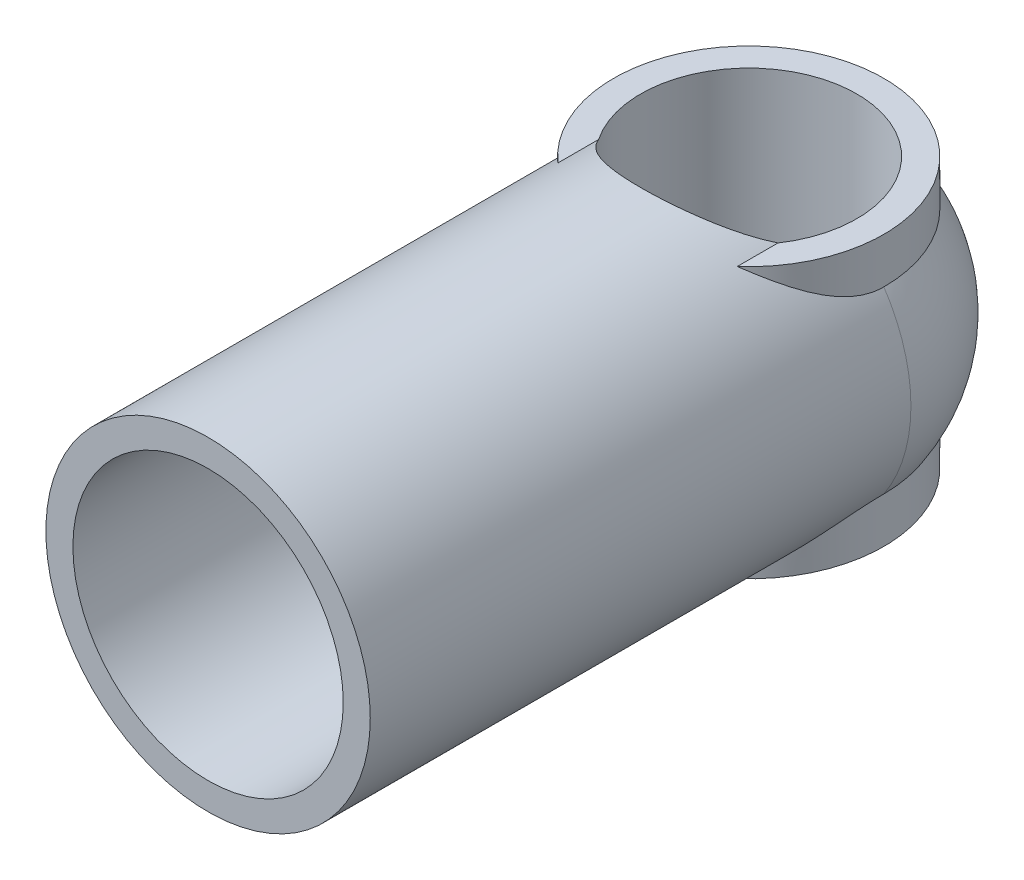
ISO-10303-21;
HEADER;
FILE_DESCRIPTION(('STEP AP214'),'2;1');
FILE_NAME('part.step','',(''),(''),'','','');
FILE_SCHEMA(('AUTOMOTIVE_DESIGN { 1 0 10303 214 1 1 1 1 }'));
ENDSEC;
DATA;
#1=APPLICATION_CONTEXT('core data for automotive mechanical design processes');
#2=APPLICATION_PROTOCOL_DEFINITION('international standard','automotive_design',2000,#1);
#3=PRODUCT_CONTEXT('',#1,'mechanical');
#4=PRODUCT('Part','Part','',(#3));
#5=PRODUCT_RELATED_PRODUCT_CATEGORY('part','',(#4));
#6=PRODUCT_DEFINITION_FORMATION('','',#4);
#7=PRODUCT_DEFINITION_CONTEXT('part definition',#1,'design');
#8=PRODUCT_DEFINITION('design','',#6,#7);
#9=PRODUCT_DEFINITION_SHAPE('','',#8);
#10=(LENGTH_UNIT() NAMED_UNIT(*) SI_UNIT(.MILLI.,.METRE.));
#11=(NAMED_UNIT(*) PLANE_ANGLE_UNIT() SI_UNIT($,.RADIAN.));
#12=(NAMED_UNIT(*) SI_UNIT($,.STERADIAN.) SOLID_ANGLE_UNIT());
#13=UNCERTAINTY_MEASURE_WITH_UNIT(LENGTH_MEASURE(1.E-05),#10,'distance_accuracy_value','');
#14=(GEOMETRIC_REPRESENTATION_CONTEXT(3) GLOBAL_UNCERTAINTY_ASSIGNED_CONTEXT((#13)) GLOBAL_UNIT_ASSIGNED_CONTEXT((#10,
#11,#12)) REPRESENTATION_CONTEXT('',''));
#15=CARTESIAN_POINT('',(0.,0.,0.));
#16=DIRECTION('',(0.,0.,1.));
#17=DIRECTION('',(1.,0.,0.));
#18=AXIS2_PLACEMENT_3D('',#15,#16,#17);
#19=CARTESIAN_POINT('',(0.,0.,40.));
#20=DIRECTION('',(0.,0.,-1.));
#21=DIRECTION('',(-1.,0.,0.));
#22=AXIS2_PLACEMENT_3D('',#19,#20,#21);
#23=CYLINDRICAL_SURFACE('',#22,12.);
#24=CARTESIAN_POINT('',(0.,0.,40.));
#25=DIRECTION('',(0.,0.,1.));
#26=DIRECTION('',(1.,0.,0.));
#27=AXIS2_PLACEMENT_3D('',#24,#25,#26);
#28=CIRCLE('',#27,12.);
#29=CARTESIAN_POINT('',(12.,0.,40.));
#30=VERTEX_POINT('',#29);
#31=EDGE_CURVE('E172',#30,#30,#28,.T.);
#32=ORIENTED_EDGE('',*,*,#31,.F.);
#33=EDGE_LOOP('',(#32));
#34=FACE_BOUND('',#33,.T.);
#35=DIRECTION('',(0.,0.,-1.));
#36=VECTOR('',#35,1.);
#37=CARTESIAN_POINT('',(-6.63324958071081,-10.,40.));
#38=LINE('',#37,#36);
#39=CARTESIAN_POINT('',(-6.63324958071081,-10.,4.47213595499957));
#40=VERTEX_POINT('',#39);
#41=CARTESIAN_POINT('',(-6.63324958071081,-10.,7.48331477354788));
#42=VERTEX_POINT('',#41);
#43=EDGE_CURVE('E94',#40,#42,#38,.F.);
#44=ORIENTED_EDGE('',*,*,#43,.F.);
#45=CARTESIAN_POINT('',(-8.,-8.94427190999916,-1.04083408558608E-13));
#46=CARTESIAN_POINT('',(-8.00000156789018,-8.94426730556881,0.0983267580334694));
#47=CARTESIAN_POINT('',(-7.99818670435959,-8.94589413251496,0.19663692154409));
#48=CARTESIAN_POINT('',(-7.99094455096907,-8.95236504839336,0.393008480709832));
#49=CARTESIAN_POINT('',(-7.98551762121139,-8.95720881661493,0.491069900185157));
#50=CARTESIAN_POINT('',(-7.96387184062538,-8.97647716057883,0.784275547939782));
#51=CARTESIAN_POINT('',(-7.94228785626225,-8.99563906641541,0.97875561296264));
#52=CARTESIAN_POINT('',(-7.88553713067692,-9.04542400400453,1.3621756628165));
#53=CARTESIAN_POINT('',(-7.85050660718139,-9.07593200272896,1.5511513890597));
#54=CARTESIAN_POINT('',(-7.76746828307472,-9.14709903834019,1.92431409503248));
#55=CARTESIAN_POINT('',(-7.71945670791759,-9.18776102747531,2.10849966480892));
#56=CARTESIAN_POINT('',(-7.61144235043443,-9.27743689505695,2.47009563813124));
#57=CARTESIAN_POINT('',(-7.55150366675385,-9.32640593075368,2.64753646548088));
#58=CARTESIAN_POINT('',(-7.42016704049034,-9.43123454567664,2.99596211553798));
#59=CARTESIAN_POINT('',(-7.34876968036537,-9.48709377463288,3.16694726584969));
#60=CARTESIAN_POINT('',(-7.11790219790263,-9.66296505643642,3.67043005761594));
#61=CARTESIAN_POINT('',(-6.94199342859117,-9.79106502579735,3.9926754805717));
#62=CARTESIAN_POINT('',(-6.51998353653231,-10.0779176796739,4.65477324863641));
#63=CARTESIAN_POINT('',(-6.26723770899271,-10.238349008843,4.98965909743894));
#64=CARTESIAN_POINT('',(-5.85130862662402,-10.4779751838524,5.45948237205756));
#65=CARTESIAN_POINT('',(-5.70644773413527,-10.5577206171585,5.61074098939437));
#66=CARTESIAN_POINT('',(-5.40469571644934,-10.7153255023664,5.90196899658744));
#67=CARTESIAN_POINT('',(-5.24780180328283,-10.7931845116643,6.04193575468898));
#68=CARTESIAN_POINT('',(-4.89878029332723,-10.9564719143012,6.32931356915454));
#69=CARTESIAN_POINT('',(-4.7048463828437,-11.041355236874,6.47484878457443));
#70=CARTESIAN_POINT('',(-4.30264095559407,-11.2042099811284,6.74881076463315));
#71=CARTESIAN_POINT('',(-4.09437619772499,-11.2821846220097,6.87724551165713));
#72=CARTESIAN_POINT('',(-3.66459638595399,-11.4290096326993,7.11555065215359));
#73=CARTESIAN_POINT('',(-3.44309031168639,-11.4978660863971,7.22543343757009));
#74=CARTESIAN_POINT('',(-2.98816387633395,-11.6243952561985,7.42512865378253));
#75=CARTESIAN_POINT('',(-2.75474679821674,-11.6820710331652,7.51494657863735));
#76=CARTESIAN_POINT('',(-2.3164144377926,-11.776080218983,7.66019620321885));
#77=CARTESIAN_POINT('',(-2.11297476669581,-11.8143555600214,7.71883754355442));
#78=CARTESIAN_POINT('',(-1.70051048711384,-11.8807352864914,7.82005978616316));
#79=CARTESIAN_POINT('',(-1.49148652033055,-11.9088408352006,7.86264252533222));
#80=CARTESIAN_POINT('',(-1.06971507631601,-11.9541063104235,7.93103489441557));
#81=CARTESIAN_POINT('',(-0.856970832198132,-11.9712752987013,7.95685841094325));
#82=CARTESIAN_POINT('',(-0.429481251561534,-11.9942215882236,7.99134026592934));
#83=CARTESIAN_POINT('',(-0.214735994906183,-11.999999342169,7.99999928652497));
#84=CARTESIAN_POINT('',(0.200998872446173,-12.0000006157481,8.0000006678325));
#85=CARTESIAN_POINT('',(0.401989630228009,-11.9949396394631,7.99241537595895));
#86=CARTESIAN_POINT('',(0.802320992474321,-11.9748253974432,7.96219636875078));
#87=CARTESIAN_POINT('',(1.00166168404233,-11.9597726626022,7.93956345294409));
#88=CARTESIAN_POINT('',(1.39718742073393,-11.9200414699625,7.87958706121374));
#89=CARTESIAN_POINT('',(1.593371619154,-11.895360472849,7.8422397045435));
#90=CARTESIAN_POINT('',(1.98112030391413,-11.8369594199119,7.75336889186016));
#91=CARTESIAN_POINT('',(2.17268466990461,-11.8032391288855,7.70184506697395));
#92=CARTESIAN_POINT('',(2.54903482813613,-11.7277057272826,7.58558002292616));
#93=CARTESIAN_POINT('',(2.73384930894855,-11.6859332067196,7.52090501065424));
#94=CARTESIAN_POINT('',(3.09675177593744,-11.595048108546,7.37889669945104));
#95=CARTESIAN_POINT('',(3.27483710800002,-11.5459326718263,7.3015584687243));
#96=CARTESIAN_POINT('',(3.62334928015977,-11.4413469533592,7.13502785098627));
#97=CARTESIAN_POINT('',(3.79377871576954,-11.3858788482875,7.04583952262051));
#98=CARTESIAN_POINT('',(4.12644624944078,-11.2695848754248,6.85631989674274));
#99=CARTESIAN_POINT('',(4.28868128052975,-11.2087570246444,6.75598447143506));
#100=CARTESIAN_POINT('',(4.78895821540807,-11.0091553529375,6.42148218151823));
#101=CARTESIAN_POINT('',(5.11105047702156,-10.8623130802262,6.1678639321584));
#102=CARTESIAN_POINT('',(5.71100267440304,-10.559245364369,5.6170063076623));
#103=CARTESIAN_POINT('',(5.98879950689931,-10.4030069639473,5.31970584033884));
#104=CARTESIAN_POINT('',(6.38982332525424,-10.1587350672016,4.81927680095673));
#105=CARTESIAN_POINT('',(6.5289067127972,-10.0696635944393,4.62915732646949));
#106=CARTESIAN_POINT('',(6.790506421138,-9.89513627346488,4.23612517150592));
#107=CARTESIAN_POINT('',(6.91301883074995,-9.80968128209622,4.03320948730104));
#108=CARTESIAN_POINT('',(7.14035410839682,-9.64546479898197,3.6154968811655));
#109=CARTESIAN_POINT('',(7.24520022041413,-9.56669458076941,3.40071607272704));
#110=CARTESIAN_POINT('',(7.4362646991973,-9.41894704167474,2.95967603863945));
#111=CARTESIAN_POINT('',(7.52248215669181,-9.34997019886713,2.73341625336261));
#112=CARTESIAN_POINT('',(7.6532719316199,-9.24296556618735,2.3362218522074));
#113=CARTESIAN_POINT('',(7.70272461402338,-9.2017036387181,2.16775255363057));
#114=CARTESIAN_POINT('',(7.79073760537602,-9.12730693076933,1.82632161845445));
#115=CARTESIAN_POINT('',(7.82930511820845,-9.09416677716318,1.65336303606162));
#116=CARTESIAN_POINT('',(7.8949643349913,-9.03722451387873,1.30422894864387));
#117=CARTESIAN_POINT('',(7.9220851030285,-9.01339876576859,1.12806279017626));
#118=CARTESIAN_POINT('',(7.964537494883,-8.97590979381429,0.7733110491091));
#119=CARTESIAN_POINT('',(7.97987664856908,-8.96224007922604,0.594727086181776));
#120=CARTESIAN_POINT('',(7.99279524732634,-8.95071163063377,0.346458814653859));
#121=CARTESIAN_POINT('',(7.99549666828367,-8.94829809746154,0.277203204796281));
#122=CARTESIAN_POINT('',(7.99909863324228,-8.94507836256932,0.138634676569926));
#123=CARTESIAN_POINT('',(7.99999987284276,-8.94427154000857,0.0693217906942163));
#124=CARTESIAN_POINT('',(8.,-8.94427190999916,-1.04191759657056E-13));
#125=B_SPLINE_CURVE_WITH_KNOTS('',3,(#45,#46,#47,#48,#49,#50,#51,#52,#53,#54,#55,#56,#57,#58,
#59,#60,#61,#62,#63,#64,#65,#66,#67,#68,#69,#70,#71,#72,#73,#74,#75,#76,#77,#78,#79,#80,#81,#82,
#83,#84,#85,#86,#87,#88,#89,#90,#91,#92,#93,#94,#95,#96,#97,#98,#99,#100,#101,#102,#103,#104,
#105,#106,#107,#108,#109,#110,#111,#112,#113,#114,#115,#116,#117,#118,#119,#120,#121,#122,#123,
#124),.UNSPECIFIED.,.F.,.F.,(4,2,2,2,2,2,2,2,2,2,2,2,2,2,2,2,2,2,2,2,2,2,2,2,2,2,2,2,2,2,2,2,2,
2,2,2,2,2,2,4),(0.,0.294917689728941,0.589805982261819,1.17864334908669,1.76166665193123,
2.3448596651691,2.92499924717827,3.50510934934578,4.66782539580381,6.01010568592188,
6.68192751428292,7.3539054721927,8.12357250153253,8.89287898631928,9.66166955551358,
10.4302493596306,11.0748576076597,11.7193920984762,12.3633918468604,13.0073660014255,
13.6101437472274,14.2128894680975,14.8157942620109,15.4187147450503,16.0186719299651,
16.6188633313887,17.2188496952757,17.8190589807307,19.1202156443323,20.4232096869364,
21.1779635276551,21.9328952003946,22.6868257006626,23.4407929922417,23.9813728190394,
24.5215940428142,25.0604352329559,25.5989317515327,25.8069492891925,26.01488643226),.UNSPECIFIED.);
#126=CARTESIAN_POINT('',(6.63324958071081,-10.,4.47213595499957));
#127=VERTEX_POINT('',#126);
#128=EDGE_CURVE('E92',#40,#127,#125,.T.);
#129=ORIENTED_EDGE('',*,*,#128,.T.);
#130=DIRECTION('',(0.,0.,-1.));
#131=VECTOR('',#130,1.);
#132=CARTESIAN_POINT('',(6.63324958071081,-10.,40.));
#133=LINE('',#132,#131);
#134=CARTESIAN_POINT('',(6.63324958071081,-10.,7.48331477354788));
#135=VERTEX_POINT('',#134);
#136=EDGE_CURVE('E52',#135,#127,#133,.T.);
#137=ORIENTED_EDGE('',*,*,#136,.F.);
#138=CARTESIAN_POINT('',(10.,-6.6332495807108,0.));
#139=CARTESIAN_POINT('',(10.0000426040486,-6.63312059455446,0.178791920948411));
#140=CARTESIAN_POINT('',(9.99520705323369,-6.64047500157451,0.35750316595917));
#141=CARTESIAN_POINT('',(9.97612509914507,-6.66914149143689,0.712960788578367));
#142=CARTESIAN_POINT('',(9.96189691559543,-6.69042655107052,0.889710297938336));
#143=CARTESIAN_POINT('',(9.9246731553512,-6.74550785991562,1.23733842380129));
#144=CARTESIAN_POINT('',(9.9018216002757,-6.77909833676952,1.4082657290459));
#145=CARTESIAN_POINT('',(9.84782900359468,-6.85729785276926,1.74630255045882));
#146=CARTESIAN_POINT('',(9.81668335482959,-6.90191301485348,1.91340988854108));
#147=CARTESIAN_POINT('',(9.73278783315797,-7.01996660350905,2.30827325065062));
#148=CARTESIAN_POINT('',(9.67636320133585,-7.09783040301443,2.53392664232732));
#149=CARTESIAN_POINT('',(9.54969672891459,-7.26735736549624,2.97593901963864));
#150=CARTESIAN_POINT('',(9.47944948622349,-7.3590259202889,3.19229433103081));
#151=CARTESIAN_POINT('',(9.32523049703074,-7.5535195629256,3.61828699261961));
#152=CARTESIAN_POINT('',(9.24110423121158,-7.65646528490525,3.82781263060636));
#153=CARTESIAN_POINT('',(9.060445194766,-7.86942562828953,4.23774926053508));
#154=CARTESIAN_POINT('',(8.96390852559645,-7.97944246552588,4.43815736144046));
#155=CARTESIAN_POINT('',(8.71835163271372,-8.24835010211914,4.90771638420047));
#156=CARTESIAN_POINT('',(8.5636740082573,-8.40936240307872,5.17270887922513));
#157=CARTESIAN_POINT('',(8.23173405350729,-8.73456562095351,5.68612476161365));
#158=CARTESIAN_POINT('',(8.05446479664428,-8.89875749957517,5.93454303159996));
#159=CARTESIAN_POINT('',(7.68183555002716,-9.22219402757344,6.4092368556551));
#160=CARTESIAN_POINT('',(7.48698047722497,-9.38146609147084,6.63588824839984));
#161=CARTESIAN_POINT('',(7.17878925369744,-9.61674089921453,6.96329173032923));
#162=CARTESIAN_POINT('',(7.07342011627998,-9.69455176606499,7.07031932709314));
#163=CARTESIAN_POINT('',(6.85734211239017,-9.84857653342264,7.28007661605012));
#164=CARTESIAN_POINT('',(6.7466326180057,-9.92479024461976,7.3828058001767));
#165=CARTESIAN_POINT('',(6.63324958071084,-10.0000000000001,7.48331477354785));
#166=B_SPLINE_CURVE_WITH_KNOTS('',3,(#138,#139,#140,#141,#142,#143,#144,#145,#146,#147,#148,
#149,#150,#151,#152,#153,#154,#155,#156,#157,#158,#159,#160,#161,#162,#163,#164,#165),
.UNSPECIFIED.,.F.,.F.,(4,2,2,2,2,2,2,2,2,2,2,2,2,4),(0.,0.536030374549658,1.07102400673645,
1.59745188706083,2.12417279694578,2.85884465429573,3.59380420518528,4.3375796611684,
5.0815893366724,6.1198409762916,7.15841171200591,8.17329126734617,8.68061728852369,
9.18800310651905),.UNSPECIFIED.);
#167=CARTESIAN_POINT('',(10.,-6.6332495807108,0.));
#168=VERTEX_POINT('',#167);
#169=EDGE_CURVE('E151',#168,#135,#166,.T.);
#170=ORIENTED_EDGE('',*,*,#169,.F.);
#171=CARTESIAN_POINT('',(0.,0.,0.));
#172=DIRECTION('',(0.,0.,-1.));
#173=DIRECTION('',(-1.,0.,0.));
#174=AXIS2_PLACEMENT_3D('',#171,#172,#173);
#175=CIRCLE('',#174,12.);
#176=CARTESIAN_POINT('',(10.,6.6332495807108,0.));
#177=VERTEX_POINT('',#176);
#178=EDGE_CURVE('E168',#177,#168,#175,.T.);
#179=ORIENTED_EDGE('',*,*,#178,.F.);
#180=CARTESIAN_POINT('',(6.63324958071081,10.,7.48331477354788));
#181=CARTESIAN_POINT('',(6.74865499389378,9.92344873407704,7.38101271959003));
#182=CARTESIAN_POINT('',(6.86129035768478,9.84585757630498,7.27641126548271));
#183=CARTESIAN_POINT('',(7.0810281244004,9.68902802219419,7.06275730667234));
#184=CARTESIAN_POINT('',(7.18813117473324,9.60978982012651,6.95370532546938));
#185=CARTESIAN_POINT('',(7.50126034882193,9.37017377852897,6.61998569193675));
#186=CARTESIAN_POINT('',(7.69903114665118,9.20794505408822,6.38882134196072));
#187=CARTESIAN_POINT('',(8.07643559458858,8.87891973957806,5.90486378121123));
#188=CARTESIAN_POINT('',(8.25558687066455,8.71210002174068,5.65171196481019));
#189=CARTESIAN_POINT('',(8.59052671458209,8.38200589680153,5.12829068254625));
#190=CARTESIAN_POINT('',(8.74632440990346,8.21873012603865,4.85802796333646));
#191=CARTESIAN_POINT('',(8.98438935219165,7.95616237785604,4.39580857321355));
#192=CARTESIAN_POINT('',(9.07351718004908,7.85417766671017,4.20888817027708));
#193=CARTESIAN_POINT('',(9.24101699265081,7.65639414944364,3.82714555550245));
#194=CARTESIAN_POINT('',(9.31939201547375,7.560593600128,3.63232559582874));
#195=CARTESIAN_POINT('',(9.46403817097241,7.37870865646232,3.23664490278181));
#196=CARTESIAN_POINT('',(9.53043111334819,7.29253033337655,3.03587235947471));
#197=CARTESIAN_POINT('',(9.65134889027329,7.1317310331535,2.62622229810746));
#198=CARTESIAN_POINT('',(9.70587527022926,7.05710855144094,2.41734583961647));
#199=CARTESIAN_POINT('',(9.79329451607234,6.93512488916626,2.03056986441014));
#200=CARTESIAN_POINT('',(9.82831819391183,6.88527396935418,1.85394245433011));
#201=CARTESIAN_POINT('',(9.88909560694533,6.79769328919794,1.49622067989042));
#202=CARTESIAN_POINT('',(9.9148550575613,6.75995605705074,1.31512914355344));
#203=CARTESIAN_POINT('',(9.95688558795155,6.69790131099448,0.946271352426657));
#204=CARTESIAN_POINT('',(9.97298704512687,6.67382408080491,0.758443920439269));
#205=CARTESIAN_POINT('',(9.98915946497099,6.64956970027187,0.475071738962868));
#206=CARTESIAN_POINT('',(9.99322037471759,6.64346163153782,0.380221575372688));
#207=CARTESIAN_POINT('',(9.99864192425435,6.63529741570711,0.190253508522947));
#208=CARTESIAN_POINT('',(10.0000020801737,6.63324199468895,0.0951355603431245));
#209=CARTESIAN_POINT('',(10.,6.63324958071117,-1.05471502102292E-13));
#210=B_SPLINE_CURVE_WITH_KNOTS('',3,(#180,#181,#182,#183,#184,#185,#186,#187,#188,#189,#190,
#191,#192,#193,#194,#195,#196,#197,#198,#199,#200,#201,#202,#203,#204,#205,#206,#207,#208,#209),
.UNSPECIFIED.,.F.,.F.,(4,2,2,2,2,2,2,2,2,2,2,2,2,2,4),(0.,0.516432990742385,1.03280540936431,
2.0658875430659,3.12121993429412,4.17613877940875,4.86824651837811,5.56015830595957,
6.24458220122065,6.92891690915046,7.48883821755688,8.04841349618615,8.61754883085116,
8.90283865328719,9.18817958403717),.UNSPECIFIED.);
#211=CARTESIAN_POINT('',(6.63324958071081,10.,7.48331477354788));
#212=VERTEX_POINT('',#211);
#213=EDGE_CURVE('E118',#212,#177,#210,.T.);
#214=ORIENTED_EDGE('',*,*,#213,.F.);
#215=DIRECTION('',(0.,0.,-1.));
#216=VECTOR('',#215,1.);
#217=CARTESIAN_POINT('',(6.63324958071081,10.,40.));
#218=LINE('',#217,#216);
#219=CARTESIAN_POINT('',(6.63324958071081,10.,4.47213595499957));
#220=VERTEX_POINT('',#219);
#221=EDGE_CURVE('E162',#212,#220,#218,.T.);
#222=ORIENTED_EDGE('',*,*,#221,.T.);
#223=CARTESIAN_POINT('',(8.,8.94427190999916,-1.04083408558608E-13));
#224=CARTESIAN_POINT('',(8.00000156789018,8.94426730556881,0.0983267580334694));
#225=CARTESIAN_POINT('',(7.99818670435959,8.94589413251496,0.19663692154409));
#226=CARTESIAN_POINT('',(7.99094455096907,8.95236504839336,0.393008480709832));
#227=CARTESIAN_POINT('',(7.98551762121139,8.95720881661493,0.491069900185157));
#228=CARTESIAN_POINT('',(7.96387184062538,8.97647716057883,0.784275547939781));
#229=CARTESIAN_POINT('',(7.94228785626225,8.99563906641541,0.978755612962639));
#230=CARTESIAN_POINT('',(7.88553713067692,9.04542400400453,1.3621756628165));
#231=CARTESIAN_POINT('',(7.85050660718139,9.07593200272896,1.5511513890597));
#232=CARTESIAN_POINT('',(7.76746828307473,9.14709903834019,1.92431409503248));
#233=CARTESIAN_POINT('',(7.71945670791759,9.18776102747531,2.10849966480892));
#234=CARTESIAN_POINT('',(7.61144235043443,9.27743689505695,2.47009563813124));
#235=CARTESIAN_POINT('',(7.55150366675385,9.32640593075368,2.64753646548088));
#236=CARTESIAN_POINT('',(7.42016704049034,9.43123454567664,2.99596211553798));
#237=CARTESIAN_POINT('',(7.34876968036537,9.48709377463288,3.16694726584969));
#238=CARTESIAN_POINT('',(7.11790219790263,9.66296505643642,3.67043005761594));
#239=CARTESIAN_POINT('',(6.94199342859117,9.79106502579735,3.9926754805717));
#240=CARTESIAN_POINT('',(6.51998353653231,10.0779176796739,4.65477324863641));
#241=CARTESIAN_POINT('',(6.26723770899271,10.238349008843,4.98965909743893));
#242=CARTESIAN_POINT('',(5.85130862662403,10.4779751838524,5.45948237205756));
#243=CARTESIAN_POINT('',(5.70644773413527,10.5577206171585,5.61074098939437));
#244=CARTESIAN_POINT('',(5.40469571644934,10.7153255023664,5.90196899658744));
#245=CARTESIAN_POINT('',(5.24780180328283,10.7931845116643,6.04193575468897));
#246=CARTESIAN_POINT('',(4.89878029332723,10.9564719143012,6.32931356915454));
#247=CARTESIAN_POINT('',(4.7048463828437,11.041355236874,6.47484878457443));
#248=CARTESIAN_POINT('',(4.30264095559408,11.2042099811284,6.74881076463314));
#249=CARTESIAN_POINT('',(4.094376197725,11.2821846220097,6.87724551165713));
#250=CARTESIAN_POINT('',(3.66459638595399,11.4290096326993,7.11555065215359));
#251=CARTESIAN_POINT('',(3.44309031168639,11.4978660863971,7.22543343757008));
#252=CARTESIAN_POINT('',(2.98816387633396,11.6243952561985,7.42512865378253));
#253=CARTESIAN_POINT('',(2.75474679821675,11.6820710331652,7.51494657863734));
#254=CARTESIAN_POINT('',(2.3164144377926,11.776080218983,7.66019620321885));
#255=CARTESIAN_POINT('',(2.11297476669581,11.8143555600214,7.71883754355442));
#256=CARTESIAN_POINT('',(1.70051048711385,11.8807352864914,7.82005978616316));
#257=CARTESIAN_POINT('',(1.49148652033055,11.9088408352006,7.86264252533222));
#258=CARTESIAN_POINT('',(1.06971507631601,11.9541063104235,7.93103489441557));
#259=CARTESIAN_POINT('',(0.856970832198136,11.9712752987013,7.95685841094325));
#260=CARTESIAN_POINT('',(0.429481251561537,11.9942215882236,7.99134026592934));
#261=CARTESIAN_POINT('',(0.214735994906185,11.999999342169,7.99999928652497));
#262=CARTESIAN_POINT('',(-0.200998872446171,12.0000006157481,8.0000006678325));
#263=CARTESIAN_POINT('',(-0.401989630228008,11.9949396394631,7.99241537595895));
#264=CARTESIAN_POINT('',(-0.80232099247432,11.9748253974432,7.96219636875078));
#265=CARTESIAN_POINT('',(-1.00166168404233,11.9597726626022,7.93956345294409));
#266=CARTESIAN_POINT('',(-1.39718742073393,11.9200414699625,7.87958706121374));
#267=CARTESIAN_POINT('',(-1.593371619154,11.895360472849,7.8422397045435));
#268=CARTESIAN_POINT('',(-1.98112030391413,11.8369594199119,7.75336889186016));
#269=CARTESIAN_POINT('',(-2.17268466990461,11.8032391288855,7.70184506697395));
#270=CARTESIAN_POINT('',(-2.54903482813613,11.7277057272826,7.58558002292616));
#271=CARTESIAN_POINT('',(-2.73384930894855,11.6859332067196,7.52090501065424));
#272=CARTESIAN_POINT('',(-3.09675177593744,11.595048108546,7.37889669945104));
#273=CARTESIAN_POINT('',(-3.27483710800002,11.5459326718263,7.3015584687243));
#274=CARTESIAN_POINT('',(-3.62334928015977,11.4413469533592,7.13502785098627));
#275=CARTESIAN_POINT('',(-3.79377871576954,11.3858788482875,7.04583952262051));
#276=CARTESIAN_POINT('',(-4.12644624944078,11.2695848754248,6.85631989674274));
#277=CARTESIAN_POINT('',(-4.28868128052975,11.2087570246444,6.75598447143506));
#278=CARTESIAN_POINT('',(-4.78895821540807,11.0091553529375,6.42148218151823));
#279=CARTESIAN_POINT('',(-5.11105047702156,10.8623130802262,6.1678639321584));
#280=CARTESIAN_POINT('',(-5.71100267440304,10.559245364369,5.6170063076623));
#281=CARTESIAN_POINT('',(-5.98879950689931,10.4030069639473,5.31970584033884));
#282=CARTESIAN_POINT('',(-6.38982332525424,10.1587350672016,4.81927680095673));
#283=CARTESIAN_POINT('',(-6.5289067127972,10.0696635944393,4.62915732646949));
#284=CARTESIAN_POINT('',(-6.790506421138,9.89513627346488,4.23612517150592));
#285=CARTESIAN_POINT('',(-6.91301883074995,9.80968128209622,4.03320948730104));
#286=CARTESIAN_POINT('',(-7.14035410839682,9.64546479898197,3.6154968811655));
#287=CARTESIAN_POINT('',(-7.24520022041413,9.56669458076941,3.40071607272704));
#288=CARTESIAN_POINT('',(-7.4362646991973,9.41894704167474,2.95967603863945));
#289=CARTESIAN_POINT('',(-7.52248215669181,9.34997019886714,2.73341625336261));
#290=CARTESIAN_POINT('',(-7.6532719316199,9.24296556618735,2.33622185220741));
#291=CARTESIAN_POINT('',(-7.70272461402338,9.2017036387181,2.16775255363058));
#292=CARTESIAN_POINT('',(-7.79073760537602,9.12730693076933,1.82632161845445));
#293=CARTESIAN_POINT('',(-7.82930511820845,9.09416677716317,1.65336303606162));
#294=CARTESIAN_POINT('',(-7.8949643349913,9.03722451387873,1.30422894864387));
#295=CARTESIAN_POINT('',(-7.9220851030285,9.01339876576859,1.12806279017626));
#296=CARTESIAN_POINT('',(-7.964537494883,8.97590979381429,0.773311049109102));
#297=CARTESIAN_POINT('',(-7.97987664856908,8.96224007922604,0.594727086181777));
#298=CARTESIAN_POINT('',(-7.99279524732634,8.95071163063377,0.346458814653859));
#299=CARTESIAN_POINT('',(-7.99549666828367,8.94829809746154,0.277203204796282));
#300=CARTESIAN_POINT('',(-7.99909863324228,8.94507836256932,0.138634676569926));
#301=CARTESIAN_POINT('',(-7.99999987284276,8.94427154000857,0.0693217906942163));
#302=CARTESIAN_POINT('',(-8.,8.94427190999916,-1.04139850041113E-13));
#303=B_SPLINE_CURVE_WITH_KNOTS('',3,(#223,#224,#225,#226,#227,#228,#229,#230,#231,#232,#233,
#234,#235,#236,#237,#238,#239,#240,#241,#242,#243,#244,#245,#246,#247,#248,#249,#250,#251,#252,
#253,#254,#255,#256,#257,#258,#259,#260,#261,#262,#263,#264,#265,#266,#267,#268,#269,#270,#271,
#272,#273,#274,#275,#276,#277,#278,#279,#280,#281,#282,#283,#284,#285,#286,#287,#288,#289,#290,
#291,#292,#293,#294,#295,#296,#297,#298,#299,#300,#301,#302),.UNSPECIFIED.,.F.,.F.,(4,2,2,2,2,2,
2,2,2,2,2,2,2,2,2,2,2,2,2,2,2,2,2,2,2,2,2,2,2,2,2,2,2,2,2,2,2,2,2,4),(0.,0.294917689728941,
0.589805982261819,1.17864334908669,1.76166665193123,2.34485966516909,2.92499924717827,
3.50510934934578,4.66782539580381,6.01010568592188,6.68192751428292,7.3539054721927,
8.12357250153253,8.89287898631927,9.66166955551357,10.4302493596305,11.0748576076597,
11.7193920984762,12.3633918468604,13.0073660014255,13.6101437472274,14.2128894680975,
14.8157942620109,15.4187147450503,16.0186719299651,16.6188633313887,17.2188496952757,
17.8190589807307,19.1202156443323,20.4232096869364,21.1779635276551,21.9328952003946,
22.6868257006626,23.4407929922417,23.9813728190394,24.5215940428142,25.0604352329559,
25.5989317515326,25.8069492891925,26.01488643226),.UNSPECIFIED.);
#304=CARTESIAN_POINT('',(-6.63324958071081,10.,4.47213595499957));
#305=VERTEX_POINT('',#304);
#306=EDGE_CURVE('E98',#220,#305,#303,.T.);
#307=ORIENTED_EDGE('',*,*,#306,.T.);
#308=DIRECTION('',(0.,0.,-1.));
#309=VECTOR('',#308,1.);
#310=CARTESIAN_POINT('',(-6.63324958071081,10.,40.));
#311=LINE('',#310,#309);
#312=CARTESIAN_POINT('',(-6.63324958071081,10.,7.48331477354788));
#313=VERTEX_POINT('',#312);
#314=EDGE_CURVE('E59',#305,#313,#311,.F.);
#315=ORIENTED_EDGE('',*,*,#314,.T.);
#316=CARTESIAN_POINT('',(-10.,6.6332495807108,0.));
#317=CARTESIAN_POINT('',(-10.0000426040486,6.63312059455446,0.178791920948411));
#318=CARTESIAN_POINT('',(-9.99520705323369,6.64047500157451,0.35750316595917));
#319=CARTESIAN_POINT('',(-9.97612509914507,6.66914149143689,0.712960788578367));
#320=CARTESIAN_POINT('',(-9.96189691559543,6.69042655107052,0.889710297938336));
#321=CARTESIAN_POINT('',(-9.9246731553512,6.74550785991562,1.23733842380129));
#322=CARTESIAN_POINT('',(-9.9018216002757,6.77909833676952,1.4082657290459));
#323=CARTESIAN_POINT('',(-9.84782900359468,6.85729785276926,1.74630255045882));
#324=CARTESIAN_POINT('',(-9.81668335482959,6.90191301485348,1.91340988854108));
#325=CARTESIAN_POINT('',(-9.73278783315797,7.01996660350905,2.30827325065062));
#326=CARTESIAN_POINT('',(-9.67636320133585,7.09783040301443,2.53392664232732));
#327=CARTESIAN_POINT('',(-9.54969672891459,7.26735736549624,2.97593901963864));
#328=CARTESIAN_POINT('',(-9.47944948622349,7.3590259202889,3.19229433103081));
#329=CARTESIAN_POINT('',(-9.32523049703074,7.5535195629256,3.61828699261961));
#330=CARTESIAN_POINT('',(-9.24110423121158,7.65646528490525,3.82781263060636));
#331=CARTESIAN_POINT('',(-9.060445194766,7.86942562828953,4.23774926053508));
#332=CARTESIAN_POINT('',(-8.96390852559645,7.97944246552588,4.43815736144046));
#333=CARTESIAN_POINT('',(-8.71835163271372,8.24835010211914,4.90771638420047));
#334=CARTESIAN_POINT('',(-8.5636740082573,8.40936240307872,5.17270887922513));
#335=CARTESIAN_POINT('',(-8.23173405350729,8.73456562095351,5.68612476161365));
#336=CARTESIAN_POINT('',(-8.05446479664428,8.89875749957517,5.93454303159996));
#337=CARTESIAN_POINT('',(-7.68183555002716,9.22219402757344,6.4092368556551));
#338=CARTESIAN_POINT('',(-7.48698047722497,9.38146609147084,6.63588824839984));
#339=CARTESIAN_POINT('',(-7.17878925369744,9.61674089921453,6.96329173032923));
#340=CARTESIAN_POINT('',(-7.07342011627998,9.69455176606499,7.07031932709314));
#341=CARTESIAN_POINT('',(-6.85734211239017,9.84857653342264,7.28007661605012));
#342=CARTESIAN_POINT('',(-6.7466326180057,9.92479024461976,7.3828058001767));
#343=CARTESIAN_POINT('',(-6.63324958071084,10.0000000000001,7.48331477354785));
#344=B_SPLINE_CURVE_WITH_KNOTS('',3,(#316,#317,#318,#319,#320,#321,#322,#323,#324,#325,#326,
#327,#328,#329,#330,#331,#332,#333,#334,#335,#336,#337,#338,#339,#340,#341,#342,#343),
.UNSPECIFIED.,.F.,.F.,(4,2,2,2,2,2,2,2,2,2,2,2,2,4),(0.,0.536030374549658,1.07102400673645,
1.59745188706083,2.12417279694578,2.85884465429573,3.59380420518528,4.3375796611684,
5.0815893366724,6.1198409762916,7.15841171200591,8.17329126734617,8.68061728852369,
9.18800310651905),.UNSPECIFIED.);
#345=CARTESIAN_POINT('',(-10.,6.6332495807108,0.));
#346=VERTEX_POINT('',#345);
#347=EDGE_CURVE('E126',#346,#313,#344,.T.);
#348=ORIENTED_EDGE('',*,*,#347,.F.);
#349=CARTESIAN_POINT('',(-10.,-6.6332495807108,0.));
#350=VERTEX_POINT('',#349);
#351=EDGE_CURVE('E165',#350,#346,#175,.T.);
#352=ORIENTED_EDGE('',*,*,#351,.F.);
#353=CARTESIAN_POINT('',(-6.63324958071081,-10.,7.48331477354788));
#354=CARTESIAN_POINT('',(-6.74865499389378,-9.92344873407704,7.38101271959003));
#355=CARTESIAN_POINT('',(-6.86129035768478,-9.84585757630498,7.27641126548271));
#356=CARTESIAN_POINT('',(-7.0810281244004,-9.68902802219419,7.06275730667234));
#357=CARTESIAN_POINT('',(-7.18813117473324,-9.60978982012651,6.95370532546938));
#358=CARTESIAN_POINT('',(-7.50126034882193,-9.37017377852897,6.61998569193675));
#359=CARTESIAN_POINT('',(-7.69903114665118,-9.20794505408822,6.38882134196072));
#360=CARTESIAN_POINT('',(-8.07643559458858,-8.87891973957806,5.90486378121123));
#361=CARTESIAN_POINT('',(-8.25558687066455,-8.71210002174068,5.65171196481019));
#362=CARTESIAN_POINT('',(-8.59052671458209,-8.38200589680153,5.12829068254625));
#363=CARTESIAN_POINT('',(-8.74632440990346,-8.21873012603865,4.85802796333646));
#364=CARTESIAN_POINT('',(-8.98438935219165,-7.95616237785604,4.39580857321355));
#365=CARTESIAN_POINT('',(-9.07351718004908,-7.85417766671017,4.20888817027708));
#366=CARTESIAN_POINT('',(-9.24101699265081,-7.65639414944364,3.82714555550245));
#367=CARTESIAN_POINT('',(-9.31939201547375,-7.560593600128,3.63232559582874));
#368=CARTESIAN_POINT('',(-9.46403817097241,-7.37870865646232,3.23664490278181));
#369=CARTESIAN_POINT('',(-9.53043111334819,-7.29253033337655,3.03587235947471));
#370=CARTESIAN_POINT('',(-9.65134889027329,-7.1317310331535,2.62622229810746));
#371=CARTESIAN_POINT('',(-9.70587527022926,-7.05710855144094,2.41734583961647));
#372=CARTESIAN_POINT('',(-9.79329451607234,-6.93512488916626,2.03056986441014));
#373=CARTESIAN_POINT('',(-9.82831819391183,-6.88527396935418,1.85394245433011));
#374=CARTESIAN_POINT('',(-9.88909560694533,-6.79769328919794,1.49622067989042));
#375=CARTESIAN_POINT('',(-9.9148550575613,-6.75995605705074,1.31512914355344));
#376=CARTESIAN_POINT('',(-9.95688558795155,-6.69790131099448,0.946271352426657));
#377=CARTESIAN_POINT('',(-9.97298704512687,-6.67382408080491,0.758443920439269));
#378=CARTESIAN_POINT('',(-9.98915946497099,-6.64956970027187,0.475071738962868));
#379=CARTESIAN_POINT('',(-9.99322037471759,-6.64346163153782,0.380221575372688));
#380=CARTESIAN_POINT('',(-9.99864192425435,-6.63529741570711,0.190253508522947));
#381=CARTESIAN_POINT('',(-10.0000020801737,-6.63324199468895,0.0951355603431245));
#382=CARTESIAN_POINT('',(-10.,-6.63324958071117,-1.05471502102292E-13));
#383=B_SPLINE_CURVE_WITH_KNOTS('',3,(#353,#354,#355,#356,#357,#358,#359,#360,#361,#362,#363,
#364,#365,#366,#367,#368,#369,#370,#371,#372,#373,#374,#375,#376,#377,#378,#379,#380,#381,#382),
.UNSPECIFIED.,.F.,.F.,(4,2,2,2,2,2,2,2,2,2,2,2,2,2,4),(0.,0.516432990742385,1.03280540936431,
2.0658875430659,3.12121993429412,4.17613877940875,4.86824651837811,5.56015830595957,
6.24458220122065,6.92891690915046,7.48883821755688,8.04841349618615,8.61754883085116,
8.90283865328719,9.18817958403717),.UNSPECIFIED.);
#384=EDGE_CURVE('E146',#42,#350,#383,.T.);
#385=ORIENTED_EDGE('',*,*,#384,.F.);
#386=EDGE_LOOP('',(#44,#129,#137,#170,#179,#214,#222,#307,#315,#348,#352,#385));
#387=FACE_BOUND('',#386,.T.);
#388=ADVANCED_FACE('F37',(#34,#387),#23,.T.);
#389=CARTESIAN_POINT('',(0.,0.,40.));
#390=DIRECTION('',(0.,0.,-1.));
#391=DIRECTION('',(-1.,0.,0.));
#392=AXIS2_PLACEMENT_3D('',#389,#390,#391);
#393=CYLINDRICAL_SURFACE('',#392,10.);
#394=CARTESIAN_POINT('',(0.,0.,40.));
#395=DIRECTION('',(0.,0.,1.));
#396=DIRECTION('',(1.,0.,0.));
#397=AXIS2_PLACEMENT_3D('',#394,#395,#396);
#398=CIRCLE('',#397,10.);
#399=CARTESIAN_POINT('',(10.,0.,40.));
#400=VERTEX_POINT('',#399);
#401=EDGE_CURVE('E169',#400,#400,#398,.T.);
#402=ORIENTED_EDGE('',*,*,#401,.T.);
#403=EDGE_LOOP('',(#402));
#404=FACE_BOUND('',#403,.T.);
#405=CARTESIAN_POINT('',(0.,0.,0.));
#406=DIRECTION('',(0.,0.707106781186547,-0.707106781186547));
#407=DIRECTION('',(0.,-0.707106781186547,-0.707106781186547));
#408=AXIS2_PLACEMENT_3D('',#405,#406,#407);
#409=ELLIPSE('',#408,14.1421356237309,10.);
#410=CARTESIAN_POINT('',(-10.,0.,0.));
#411=VERTEX_POINT('',#410);
#412=CARTESIAN_POINT('',(10.,0.,0.));
#413=VERTEX_POINT('',#412);
#414=EDGE_CURVE('E156',#411,#413,#409,.T.);
#415=ORIENTED_EDGE('',*,*,#414,.T.);
#416=CARTESIAN_POINT('',(0.,0.,0.));
#417=DIRECTION('',(0.,-0.707106781186547,-0.707106781186547));
#418=DIRECTION('',(0.,0.707106781186547,-0.707106781186547));
#419=AXIS2_PLACEMENT_3D('',#416,#417,#418);
#420=ELLIPSE('',#419,14.1421356237309,10.);
#421=EDGE_CURVE('E158',#413,#411,#420,.T.);
#422=ORIENTED_EDGE('',*,*,#421,.T.);
#423=EDGE_LOOP('',(#415,#422));
#424=FACE_BOUND('',#423,.T.);
#425=ADVANCED_FACE('F195',(#404,#424),#393,.F.);
#426=CARTESIAN_POINT('',(0.,0.,0.));
#427=DIRECTION('',(0.,0.,-1.));
#428=DIRECTION('',(1.,0.,0.));
#429=AXIS2_PLACEMENT_3D('',#426,#427,#428);
#430=SPHERICAL_SURFACE('',#429,12.);
#431=ORIENTED_EDGE('',*,*,#178,.T.);
#432=CARTESIAN_POINT('',(0.,-6.6332495807108,0.));
#433=DIRECTION('',(0.,1.,0.));
#434=DIRECTION('',(0.,0.,1.));
#435=AXIS2_PLACEMENT_3D('',#432,#433,#434);
#436=CIRCLE('',#435,10.);
#437=EDGE_CURVE('E11',#168,#350,#436,.T.);
#438=ORIENTED_EDGE('',*,*,#437,.T.);
#439=ORIENTED_EDGE('',*,*,#351,.T.);
#440=CARTESIAN_POINT('',(0.,6.6332495807108,0.));
#441=DIRECTION('',(0.,-1.,0.));
#442=DIRECTION('',(0.,0.,-1.));
#443=AXIS2_PLACEMENT_3D('',#440,#441,#442);
#444=CIRCLE('',#443,10.);
#445=EDGE_CURVE('E45',#346,#177,#444,.T.);
#446=ORIENTED_EDGE('',*,*,#445,.T.);
#447=EDGE_LOOP('',(#431,#438,#439,#446));
#448=FACE_BOUND('',#447,.T.);
#449=ADVANCED_FACE('F140',(#448),#430,.T.);
#450=CARTESIAN_POINT('',(0.,0.,40.));
#451=DIRECTION('',(0.,0.,1.));
#452=DIRECTION('',(1.,0.,0.));
#453=AXIS2_PLACEMENT_3D('',#450,#451,#452);
#454=PLANE('',#453);
#455=ORIENTED_EDGE('',*,*,#31,.T.);
#456=EDGE_LOOP('',(#455));
#457=FACE_BOUND('',#456,.T.);
#458=ORIENTED_EDGE('',*,*,#401,.F.);
#459=EDGE_LOOP('',(#458));
#460=FACE_BOUND('',#459,.T.);
#461=ADVANCED_FACE('F203',(#457,#460),#454,.T.);
#462=CARTESIAN_POINT('',(0.,10.,0.));
#463=DIRECTION('',(0.,-1.,0.));
#464=DIRECTION('',(0.,0.,-1.));
#465=AXIS2_PLACEMENT_3D('',#462,#463,#464);
#466=CYLINDRICAL_SURFACE('',#465,10.);
#467=ORIENTED_EDGE('',*,*,#445,.F.);
#468=ORIENTED_EDGE('',*,*,#347,.T.);
#469=CARTESIAN_POINT('',(0.,10.,0.));
#470=DIRECTION('',(0.,1.,0.));
#471=DIRECTION('',(0.,0.,1.));
#472=AXIS2_PLACEMENT_3D('',#469,#470,#471);
#473=CIRCLE('',#472,10.);
#474=EDGE_CURVE('E115',#212,#313,#473,.T.);
#475=ORIENTED_EDGE('',*,*,#474,.F.);
#476=ORIENTED_EDGE('',*,*,#213,.T.);
#477=EDGE_LOOP('',(#467,#468,#475,#476));
#478=FACE_BOUND('',#477,.T.);
#479=ADVANCED_FACE('F138',(#478),#466,.T.);
#480=CARTESIAN_POINT('',(0.,10.,0.));
#481=DIRECTION('',(0.,1.,0.));
#482=DIRECTION('',(0.,0.,1.));
#483=AXIS2_PLACEMENT_3D('',#480,#481,#482);
#484=PLANE('',#483);
#485=ORIENTED_EDGE('',*,*,#221,.F.);
#486=ORIENTED_EDGE('',*,*,#474,.T.);
#487=ORIENTED_EDGE('',*,*,#314,.F.);
#488=CARTESIAN_POINT('',(0.,10.,0.));
#489=DIRECTION('',(0.,1.,0.));
#490=DIRECTION('',(0.,0.,1.));
#491=AXIS2_PLACEMENT_3D('',#488,#489,#490);
#492=CIRCLE('',#491,8.);
#493=EDGE_CURVE('E109',#220,#305,#492,.T.);
#494=ORIENTED_EDGE('',*,*,#493,.F.);
#495=EDGE_LOOP('',(#485,#486,#487,#494));
#496=FACE_BOUND('',#495,.T.);
#497=ADVANCED_FACE('F184',(#496),#484,.T.);
#498=CARTESIAN_POINT('',(0.,10.,0.));
#499=DIRECTION('',(0.,-1.,0.));
#500=DIRECTION('',(0.,0.,-1.));
#501=AXIS2_PLACEMENT_3D('',#498,#499,#500);
#502=CYLINDRICAL_SURFACE('',#501,8.);
#503=CARTESIAN_POINT('',(0.,-10.,0.));
#504=DIRECTION('',(0.,1.,0.));
#505=DIRECTION('',(0.,0.,1.));
#506=AXIS2_PLACEMENT_3D('',#503,#504,#505);
#507=CIRCLE('',#506,8.);
#508=EDGE_CURVE('E103',#127,#40,#507,.T.);
#509=ORIENTED_EDGE('',*,*,#508,.F.);
#510=ORIENTED_EDGE('',*,*,#128,.F.);
#511=EDGE_LOOP('',(#509,#510));
#512=FACE_BOUND('',#511,.T.);
#513=ORIENTED_EDGE('',*,*,#493,.T.);
#514=ORIENTED_EDGE('',*,*,#306,.F.);
#515=EDGE_LOOP('',(#513,#514));
#516=FACE_BOUND('',#515,.T.);
#517=ADVANCED_FACE('F107',(#512,#516),#502,.F.);
#518=ORIENTED_EDGE('',*,*,#437,.F.);
#519=ORIENTED_EDGE('',*,*,#169,.T.);
#520=CARTESIAN_POINT('',(0.,-10.,0.));
#521=DIRECTION('',(0.,1.,0.));
#522=DIRECTION('',(0.,0.,1.));
#523=AXIS2_PLACEMENT_3D('',#520,#521,#522);
#524=CIRCLE('',#523,10.);
#525=EDGE_CURVE('E105',#135,#42,#524,.T.);
#526=ORIENTED_EDGE('',*,*,#525,.T.);
#527=ORIENTED_EDGE('',*,*,#384,.T.);
#528=EDGE_LOOP('',(#518,#519,#526,#527));
#529=FACE_BOUND('',#528,.T.);
#530=ADVANCED_FACE('F137',(#529),#466,.T.);
#531=CARTESIAN_POINT('',(0.,-10.,0.));
#532=DIRECTION('',(0.,1.,0.));
#533=DIRECTION('',(0.,0.,1.));
#534=AXIS2_PLACEMENT_3D('',#531,#532,#533);
#535=PLANE('',#534);
#536=ORIENTED_EDGE('',*,*,#525,.F.);
#537=ORIENTED_EDGE('',*,*,#136,.T.);
#538=ORIENTED_EDGE('',*,*,#508,.T.);
#539=ORIENTED_EDGE('',*,*,#43,.T.);
#540=EDGE_LOOP('',(#536,#537,#538,#539));
#541=FACE_BOUND('',#540,.T.);
#542=ADVANCED_FACE('F102',(#541),#535,.F.);
#543=ORIENTED_EDGE('',*,*,#421,.F.);
#544=ORIENTED_EDGE('',*,*,#414,.F.);
#545=EDGE_LOOP('',(#543,#544));
#546=FACE_BOUND('',#545,.T.);
#547=ADVANCED_FACE('F131',(#546),#466,.T.);
#548=CLOSED_SHELL('',(#388,#425,#449,#461,#479,#497,#517,#530,#542,#547));
#549=MANIFOLD_SOLID_BREP('B2',#548);
#550=ADVANCED_BREP_SHAPE_REPRESENTATION('',(#18,#549),#14);
#551=SHAPE_DEFINITION_REPRESENTATION(#9,#550);
ENDSEC;
END-ISO-10303-21;
